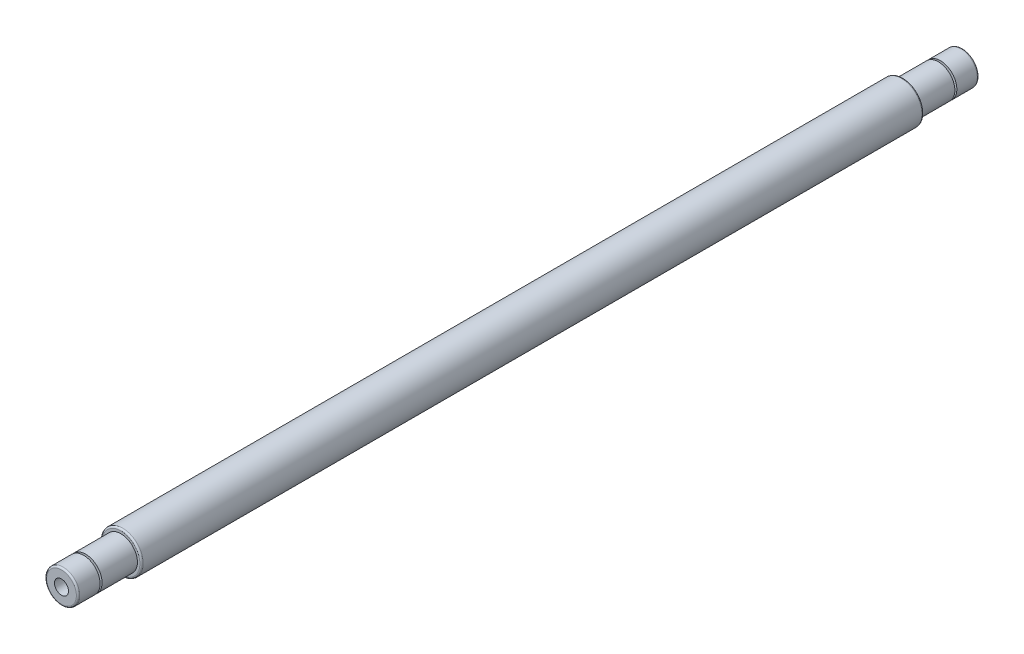
ISO-10303-21;
HEADER;
FILE_DESCRIPTION(('STEP AP214'),'2;1');
FILE_NAME('part.step','',(''),(''),'','','');
FILE_SCHEMA(('AUTOMOTIVE_DESIGN { 1 0 10303 214 1 1 1 1 }'));
ENDSEC;
DATA;
#1=APPLICATION_CONTEXT('core data for automotive mechanical design processes');
#2=APPLICATION_PROTOCOL_DEFINITION('international standard','automotive_design',2000,#1);
#3=PRODUCT_CONTEXT('',#1,'mechanical');
#4=PRODUCT('Part','Part','',(#3));
#5=PRODUCT_RELATED_PRODUCT_CATEGORY('part','',(#4));
#6=PRODUCT_DEFINITION_FORMATION('','',#4);
#7=PRODUCT_DEFINITION_CONTEXT('part definition',#1,'design');
#8=PRODUCT_DEFINITION('design','',#6,#7);
#9=PRODUCT_DEFINITION_SHAPE('','',#8);
#10=(LENGTH_UNIT() NAMED_UNIT(*) SI_UNIT(.MILLI.,.METRE.));
#11=(NAMED_UNIT(*) PLANE_ANGLE_UNIT() SI_UNIT($,.RADIAN.));
#12=(NAMED_UNIT(*) SI_UNIT($,.STERADIAN.) SOLID_ANGLE_UNIT());
#13=UNCERTAINTY_MEASURE_WITH_UNIT(LENGTH_MEASURE(1.E-05),#10,'distance_accuracy_value','');
#14=(GEOMETRIC_REPRESENTATION_CONTEXT(3) GLOBAL_UNCERTAINTY_ASSIGNED_CONTEXT((#13)) GLOBAL_UNIT_ASSIGNED_CONTEXT((#10,
#11,#12)) REPRESENTATION_CONTEXT('',''));
#15=CARTESIAN_POINT('',(0.,0.,0.));
#16=DIRECTION('',(0.,0.,1.));
#17=DIRECTION('',(1.,0.,0.));
#18=AXIS2_PLACEMENT_3D('',#15,#16,#17);
#19=CARTESIAN_POINT('',(0.,0.,510.));
#20=DIRECTION('',(0.,0.,1.));
#21=DIRECTION('',(1.,0.,0.));
#22=AXIS2_PLACEMENT_3D('',#19,#20,#21);
#23=CYLINDRICAL_SURFACE('',#22,10.);
#24=CARTESIAN_POINT('',(0.,0.,545.));
#25=DIRECTION('',(0.,0.,1.));
#26=DIRECTION('',(1.,0.,0.));
#27=AXIS2_PLACEMENT_3D('',#24,#25,#26);
#28=CIRCLE('',#27,10.);
#29=CARTESIAN_POINT('',(10.,0.,545.));
#30=VERTEX_POINT('',#29);
#31=EDGE_CURVE('E62',#30,#30,#28,.F.);
#32=ORIENTED_EDGE('',*,*,#31,.T.);
#33=EDGE_LOOP('',(#32));
#34=FACE_BOUND('',#33,.T.);
#35=CARTESIAN_POINT('',(0.,0.,532.6));
#36=DIRECTION('',(0.,0.,1.));
#37=DIRECTION('',(1.,0.,0.));
#38=AXIS2_PLACEMENT_3D('',#35,#36,#37);
#39=CIRCLE('',#38,10.);
#40=CARTESIAN_POINT('',(10.,0.,532.6));
#41=VERTEX_POINT('',#40);
#42=EDGE_CURVE('E73',#41,#41,#39,.F.);
#43=ORIENTED_EDGE('',*,*,#42,.F.);
#44=EDGE_LOOP('',(#43));
#45=FACE_BOUND('',#44,.T.);
#46=ADVANCED_FACE('F36',(#34,#45),#23,.T.);
#47=CARTESIAN_POINT('',(0.,0.,526.));
#48=DIRECTION('',(0.,0.,1.));
#49=DIRECTION('',(1.,0.,0.));
#50=AXIS2_PLACEMENT_3D('',#47,#48,#49);
#51=PLANE('',#50);
#52=CARTESIAN_POINT('',(0.,0.,526.));
#53=DIRECTION('',(0.,0.,1.));
#54=DIRECTION('',(1.,0.,0.));
#55=AXIS2_PLACEMENT_3D('',#52,#53,#54);
#56=CIRCLE('',#55,4.25);
#57=CARTESIAN_POINT('',(4.25,0.,526.));
#58=VERTEX_POINT('',#57);
#59=EDGE_CURVE('E68',#58,#58,#56,.T.);
#60=ORIENTED_EDGE('',*,*,#59,.T.);
#61=EDGE_LOOP('',(#60));
#62=FACE_BOUND('',#61,.T.);
#63=ADVANCED_FACE('F129',(#62),#51,.T.);
#64=CARTESIAN_POINT('',(0.,0.,526.));
#65=DIRECTION('',(0.,0.,1.));
#66=DIRECTION('',(1.,0.,0.));
#67=AXIS2_PLACEMENT_3D('',#64,#65,#66);
#68=CYLINDRICAL_SURFACE('',#67,4.25);
#69=ORIENTED_EDGE('',*,*,#59,.F.);
#70=EDGE_LOOP('',(#69));
#71=FACE_BOUND('',#70,.T.);
#72=CARTESIAN_POINT('',(0.,0.,546.));
#73=DIRECTION('',(0.,0.,1.));
#74=DIRECTION('',(1.,0.,0.));
#75=AXIS2_PLACEMENT_3D('',#72,#73,#74);
#76=CIRCLE('',#75,4.25);
#77=CARTESIAN_POINT('',(4.25,0.,546.));
#78=VERTEX_POINT('',#77);
#79=EDGE_CURVE('E83',#78,#78,#76,.T.);
#80=ORIENTED_EDGE('',*,*,#79,.T.);
#81=EDGE_LOOP('',(#80));
#82=FACE_BOUND('',#81,.T.);
#83=ADVANCED_FACE('F136',(#71,#82),#68,.F.);
#84=CARTESIAN_POINT('',(0.,0.,546.));
#85=DIRECTION('',(0.,0.,1.));
#86=DIRECTION('',(1.,0.,0.));
#87=AXIS2_PLACEMENT_3D('',#84,#85,#86);
#88=PLANE('',#87);
#89=CARTESIAN_POINT('',(0.,0.,546.));
#90=DIRECTION('',(0.,0.,1.));
#91=DIRECTION('',(1.,0.,0.));
#92=AXIS2_PLACEMENT_3D('',#89,#90,#91);
#93=CIRCLE('',#92,9.);
#94=CARTESIAN_POINT('',(9.,0.,546.));
#95=VERTEX_POINT('',#94);
#96=EDGE_CURVE('E65',#95,#95,#93,.T.);
#97=ORIENTED_EDGE('',*,*,#96,.T.);
#98=EDGE_LOOP('',(#97));
#99=FACE_BOUND('',#98,.T.);
#100=ORIENTED_EDGE('',*,*,#79,.F.);
#101=EDGE_LOOP('',(#100));
#102=FACE_BOUND('',#101,.T.);
#103=ADVANCED_FACE('F169',(#99,#102),#88,.T.);
#104=CARTESIAN_POINT('',(0.,0.,0.));
#105=DIRECTION('',(0.,0.,-1.));
#106=DIRECTION('',(-1.,0.,0.));
#107=AXIS2_PLACEMENT_3D('',#104,#105,#106);
#108=CYLINDRICAL_SURFACE('',#107,8.15);
#109=CARTESIAN_POINT('',(0.,0.,531.4));
#110=DIRECTION('',(0.,0.,-1.));
#111=DIRECTION('',(-1.,0.,0.));
#112=AXIS2_PLACEMENT_3D('',#109,#110,#111);
#113=CIRCLE('',#112,8.15);
#114=CARTESIAN_POINT('',(-8.15,0.,531.4));
#115=VERTEX_POINT('',#114);
#116=EDGE_CURVE('E99',#115,#115,#113,.T.);
#117=ORIENTED_EDGE('',*,*,#116,.F.);
#118=EDGE_LOOP('',(#117));
#119=FACE_BOUND('',#118,.T.);
#120=CARTESIAN_POINT('',(0.,0.,532.6));
#121=DIRECTION('',(0.,0.,-1.));
#122=DIRECTION('',(-1.,0.,0.));
#123=AXIS2_PLACEMENT_3D('',#120,#121,#122);
#124=CIRCLE('',#123,8.15);
#125=CARTESIAN_POINT('',(-8.15,0.,532.6));
#126=VERTEX_POINT('',#125);
#127=EDGE_CURVE('E103',#126,#126,#124,.T.);
#128=ORIENTED_EDGE('',*,*,#127,.T.);
#129=EDGE_LOOP('',(#128));
#130=FACE_BOUND('',#129,.T.);
#131=ADVANCED_FACE('F163',(#119,#130),#108,.T.);
#132=CARTESIAN_POINT('',(-11.85,0.,531.4));
#133=DIRECTION('',(0.,0.,-1.));
#134=DIRECTION('',(-1.,0.,0.));
#135=AXIS2_PLACEMENT_3D('',#132,#133,#134);
#136=PLANE('',#135);
#137=CARTESIAN_POINT('',(0.,0.,531.4));
#138=DIRECTION('',(0.,0.,-1.));
#139=DIRECTION('',(-1.,0.,0.));
#140=AXIS2_PLACEMENT_3D('',#137,#138,#139);
#141=CIRCLE('',#140,10.);
#142=CARTESIAN_POINT('',(-10.,0.,531.4));
#143=VERTEX_POINT('',#142);
#144=EDGE_CURVE('E69',#143,#143,#141,.F.);
#145=ORIENTED_EDGE('',*,*,#144,.T.);
#146=EDGE_LOOP('',(#145));
#147=FACE_BOUND('',#146,.T.);
#148=ORIENTED_EDGE('',*,*,#116,.T.);
#149=EDGE_LOOP('',(#148));
#150=FACE_BOUND('',#149,.T.);
#151=ADVANCED_FACE('F160',(#147,#150),#136,.F.);
#152=CARTESIAN_POINT('',(-11.85,0.,532.6));
#153=DIRECTION('',(0.,0.,1.));
#154=DIRECTION('',(1.,0.,0.));
#155=AXIS2_PLACEMENT_3D('',#152,#153,#154);
#156=PLANE('',#155);
#157=ORIENTED_EDGE('',*,*,#42,.T.);
#158=EDGE_LOOP('',(#157));
#159=FACE_BOUND('',#158,.T.);
#160=ORIENTED_EDGE('',*,*,#127,.F.);
#161=EDGE_LOOP('',(#160));
#162=FACE_BOUND('',#161,.T.);
#163=ADVANCED_FACE('F153',(#159,#162),#156,.F.);
#164=CARTESIAN_POINT('',(0.,0.,510.));
#165=DIRECTION('',(0.,0.,1.));
#166=DIRECTION('',(1.,0.,0.));
#167=AXIS2_PLACEMENT_3D('',#164,#165,#166);
#168=PLANE('',#167);
#169=CARTESIAN_POINT('',(0.,0.,510.));
#170=DIRECTION('',(0.,0.,1.));
#171=DIRECTION('',(1.,0.,0.));
#172=AXIS2_PLACEMENT_3D('',#169,#170,#171);
#173=CIRCLE('',#172,11.5);
#174=CARTESIAN_POINT('',(11.5,0.,510.));
#175=VERTEX_POINT('',#174);
#176=EDGE_CURVE('E59',#175,#175,#173,.T.);
#177=ORIENTED_EDGE('',*,*,#176,.T.);
#178=EDGE_LOOP('',(#177));
#179=FACE_BOUND('',#178,.T.);
#180=CARTESIAN_POINT('',(0.,0.,510.));
#181=DIRECTION('',(0.,0.,1.));
#182=DIRECTION('',(1.,0.,0.));
#183=AXIS2_PLACEMENT_3D('',#180,#181,#182);
#184=CIRCLE('',#183,10.);
#185=CARTESIAN_POINT('',(10.,0.,510.));
#186=VERTEX_POINT('',#185);
#187=EDGE_CURVE('E92',#186,#186,#184,.T.);
#188=ORIENTED_EDGE('',*,*,#187,.F.);
#189=EDGE_LOOP('',(#188));
#190=FACE_BOUND('',#189,.T.);
#191=ADVANCED_FACE('F144',(#179,#190),#168,.T.);
#192=ORIENTED_EDGE('',*,*,#144,.F.);
#193=EDGE_LOOP('',(#192));
#194=FACE_BOUND('',#193,.T.);
#195=ORIENTED_EDGE('',*,*,#187,.T.);
#196=EDGE_LOOP('',(#195));
#197=FACE_BOUND('',#196,.T.);
#198=ADVANCED_FACE('F132',(#194,#197),#23,.T.);
#199=CARTESIAN_POINT('',(0.,0.,546.));
#200=DIRECTION('',(0.,0.,-1.));
#201=DIRECTION('',(-1.,0.,0.));
#202=AXIS2_PLACEMENT_3D('',#199,#200,#201);
#203=CYLINDRICAL_SURFACE('',#202,12.5);
#204=CARTESIAN_POINT('',(0.,0.,509.));
#205=DIRECTION('',(0.,0.,1.));
#206=DIRECTION('',(1.,0.,0.));
#207=AXIS2_PLACEMENT_3D('',#204,#205,#206);
#208=CIRCLE('',#207,12.5);
#209=CARTESIAN_POINT('',(12.5,0.,509.));
#210=VERTEX_POINT('',#209);
#211=EDGE_CURVE('E51',#210,#210,#208,.F.);
#212=ORIENTED_EDGE('',*,*,#211,.T.);
#213=EDGE_LOOP('',(#212));
#214=FACE_BOUND('',#213,.T.);
#215=CARTESIAN_POINT('',(0.,0.,37.));
#216=DIRECTION('',(0.,0.,-1.));
#217=DIRECTION('',(-1.,0.,0.));
#218=AXIS2_PLACEMENT_3D('',#215,#216,#217);
#219=CIRCLE('',#218,12.5);
#220=CARTESIAN_POINT('',(-12.5,0.,37.));
#221=VERTEX_POINT('',#220);
#222=EDGE_CURVE('E56',#221,#221,#219,.F.);
#223=ORIENTED_EDGE('',*,*,#222,.T.);
#224=EDGE_LOOP('',(#223));
#225=FACE_BOUND('',#224,.T.);
#226=ADVANCED_FACE('F143',(#214,#225),#203,.T.);
#227=CARTESIAN_POINT('',(0.,0.,36.));
#228=DIRECTION('',(0.,0.,-1.));
#229=DIRECTION('',(-1.,0.,0.));
#230=AXIS2_PLACEMENT_3D('',#227,#228,#229);
#231=PLANE('',#230);
#232=CARTESIAN_POINT('',(0.,0.,36.));
#233=DIRECTION('',(0.,0.,-1.));
#234=DIRECTION('',(-1.,0.,0.));
#235=AXIS2_PLACEMENT_3D('',#232,#233,#234);
#236=CIRCLE('',#235,11.5);
#237=CARTESIAN_POINT('',(-11.5,0.,36.));
#238=VERTEX_POINT('',#237);
#239=EDGE_CURVE('E47',#238,#238,#236,.T.);
#240=ORIENTED_EDGE('',*,*,#239,.T.);
#241=EDGE_LOOP('',(#240));
#242=FACE_BOUND('',#241,.T.);
#243=CARTESIAN_POINT('',(0.,0.,36.));
#244=DIRECTION('',(0.,0.,-1.));
#245=DIRECTION('',(-1.,0.,0.));
#246=AXIS2_PLACEMENT_3D('',#243,#244,#245);
#247=CIRCLE('',#246,10.);
#248=CARTESIAN_POINT('',(-10.,0.,36.));
#249=VERTEX_POINT('',#248);
#250=EDGE_CURVE('E72',#249,#249,#247,.T.);
#251=ORIENTED_EDGE('',*,*,#250,.F.);
#252=EDGE_LOOP('',(#251));
#253=FACE_BOUND('',#252,.T.);
#254=ADVANCED_FACE('F150',(#242,#253),#231,.T.);
#255=CARTESIAN_POINT('',(0.,0.,36.));
#256=DIRECTION('',(0.,0.,-1.));
#257=DIRECTION('',(-1.,0.,0.));
#258=AXIS2_PLACEMENT_3D('',#255,#256,#257);
#259=CYLINDRICAL_SURFACE('',#258,10.);
#260=CARTESIAN_POINT('',(0.,0.,14.6));
#261=DIRECTION('',(0.,0.,1.));
#262=DIRECTION('',(1.,0.,0.));
#263=AXIS2_PLACEMENT_3D('',#260,#261,#262);
#264=CIRCLE('',#263,10.);
#265=CARTESIAN_POINT('',(10.,0.,14.6));
#266=VERTEX_POINT('',#265);
#267=EDGE_CURVE('E79',#266,#266,#264,.F.);
#268=ORIENTED_EDGE('',*,*,#267,.F.);
#269=EDGE_LOOP('',(#268));
#270=FACE_BOUND('',#269,.T.);
#271=ORIENTED_EDGE('',*,*,#250,.T.);
#272=EDGE_LOOP('',(#271));
#273=FACE_BOUND('',#272,.T.);
#274=ADVANCED_FACE('F180',(#270,#273),#259,.T.);
#275=CARTESIAN_POINT('',(0.,0.,0.));
#276=DIRECTION('',(0.,0.,-1.));
#277=DIRECTION('',(-1.,0.,0.));
#278=AXIS2_PLACEMENT_3D('',#275,#276,#277);
#279=CYLINDRICAL_SURFACE('',#278,8.15);
#280=CARTESIAN_POINT('',(0.,0.,13.4));
#281=DIRECTION('',(0.,0.,-1.));
#282=DIRECTION('',(-1.,0.,0.));
#283=AXIS2_PLACEMENT_3D('',#280,#281,#282);
#284=CIRCLE('',#283,8.15);
#285=CARTESIAN_POINT('',(-8.15,0.,13.4));
#286=VERTEX_POINT('',#285);
#287=EDGE_CURVE('E82',#286,#286,#284,.T.);
#288=ORIENTED_EDGE('',*,*,#287,.F.);
#289=EDGE_LOOP('',(#288));
#290=FACE_BOUND('',#289,.T.);
#291=CARTESIAN_POINT('',(0.,0.,14.6));
#292=DIRECTION('',(0.,0.,-1.));
#293=DIRECTION('',(-1.,0.,0.));
#294=AXIS2_PLACEMENT_3D('',#291,#292,#293);
#295=CIRCLE('',#294,8.15);
#296=CARTESIAN_POINT('',(-8.15,0.,14.6));
#297=VERTEX_POINT('',#296);
#298=EDGE_CURVE('E102',#297,#297,#295,.T.);
#299=ORIENTED_EDGE('',*,*,#298,.T.);
#300=EDGE_LOOP('',(#299));
#301=FACE_BOUND('',#300,.T.);
#302=ADVANCED_FACE('F111',(#290,#301),#279,.T.);
#303=CARTESIAN_POINT('',(-11.85,0.,13.4));
#304=DIRECTION('',(0.,0.,-1.));
#305=DIRECTION('',(-1.,0.,0.));
#306=AXIS2_PLACEMENT_3D('',#303,#304,#305);
#307=PLANE('',#306);
#308=CARTESIAN_POINT('',(0.,0.,13.4));
#309=DIRECTION('',(0.,0.,-1.));
#310=DIRECTION('',(-1.,0.,0.));
#311=AXIS2_PLACEMENT_3D('',#308,#309,#310);
#312=CIRCLE('',#311,10.);
#313=CARTESIAN_POINT('',(-10.,0.,13.4));
#314=VERTEX_POINT('',#313);
#315=EDGE_CURVE('E76',#314,#314,#312,.F.);
#316=ORIENTED_EDGE('',*,*,#315,.T.);
#317=EDGE_LOOP('',(#316));
#318=FACE_BOUND('',#317,.T.);
#319=ORIENTED_EDGE('',*,*,#287,.T.);
#320=EDGE_LOOP('',(#319));
#321=FACE_BOUND('',#320,.T.);
#322=ADVANCED_FACE('F116',(#318,#321),#307,.F.);
#323=CARTESIAN_POINT('',(-11.85,0.,14.6));
#324=DIRECTION('',(0.,0.,1.));
#325=DIRECTION('',(1.,0.,0.));
#326=AXIS2_PLACEMENT_3D('',#323,#324,#325);
#327=PLANE('',#326);
#328=ORIENTED_EDGE('',*,*,#267,.T.);
#329=EDGE_LOOP('',(#328));
#330=FACE_BOUND('',#329,.T.);
#331=ORIENTED_EDGE('',*,*,#298,.F.);
#332=EDGE_LOOP('',(#331));
#333=FACE_BOUND('',#332,.T.);
#334=ADVANCED_FACE('F113',(#330,#333),#327,.F.);
#335=CARTESIAN_POINT('',(0.,0.,20.));
#336=DIRECTION('',(0.,0.,-1.));
#337=DIRECTION('',(-1.,0.,0.));
#338=AXIS2_PLACEMENT_3D('',#335,#336,#337);
#339=PLANE('',#338);
#340=CARTESIAN_POINT('',(0.,0.,20.));
#341=DIRECTION('',(0.,0.,-1.));
#342=DIRECTION('',(-1.,0.,0.));
#343=AXIS2_PLACEMENT_3D('',#340,#341,#342);
#344=CIRCLE('',#343,4.25);
#345=CARTESIAN_POINT('',(-4.25,0.,20.));
#346=VERTEX_POINT('',#345);
#347=EDGE_CURVE('E86',#346,#346,#344,.T.);
#348=ORIENTED_EDGE('',*,*,#347,.T.);
#349=EDGE_LOOP('',(#348));
#350=FACE_BOUND('',#349,.T.);
#351=ADVANCED_FACE('F115',(#350),#339,.T.);
#352=CARTESIAN_POINT('',(0.,0.,20.));
#353=DIRECTION('',(0.,0.,-1.));
#354=DIRECTION('',(-1.,0.,0.));
#355=AXIS2_PLACEMENT_3D('',#352,#353,#354);
#356=CYLINDRICAL_SURFACE('',#355,4.25);
#357=ORIENTED_EDGE('',*,*,#347,.F.);
#358=EDGE_LOOP('',(#357));
#359=FACE_BOUND('',#358,.T.);
#360=CARTESIAN_POINT('',(0.,0.,0.));
#361=DIRECTION('',(0.,0.,-1.));
#362=DIRECTION('',(-1.,0.,0.));
#363=AXIS2_PLACEMENT_3D('',#360,#361,#362);
#364=CIRCLE('',#363,4.25);
#365=CARTESIAN_POINT('',(-4.25,0.,0.));
#366=VERTEX_POINT('',#365);
#367=EDGE_CURVE('E89',#366,#366,#364,.T.);
#368=ORIENTED_EDGE('',*,*,#367,.T.);
#369=EDGE_LOOP('',(#368));
#370=FACE_BOUND('',#369,.T.);
#371=ADVANCED_FACE('F123',(#359,#370),#356,.F.);
#372=CARTESIAN_POINT('',(0.,0.,0.));
#373=DIRECTION('',(0.,0.,1.));
#374=DIRECTION('',(1.,0.,0.));
#375=AXIS2_PLACEMENT_3D('',#372,#373,#374);
#376=PLANE('',#375);
#377=CARTESIAN_POINT('',(0.,0.,0.));
#378=DIRECTION('',(0.,0.,1.));
#379=DIRECTION('',(1.,0.,0.));
#380=AXIS2_PLACEMENT_3D('',#377,#378,#379);
#381=CIRCLE('',#380,9.);
#382=CARTESIAN_POINT('',(9.,0.,0.));
#383=VERTEX_POINT('',#382);
#384=EDGE_CURVE('E43',#383,#383,#381,.F.);
#385=ORIENTED_EDGE('',*,*,#384,.T.);
#386=EDGE_LOOP('',(#385));
#387=FACE_BOUND('',#386,.T.);
#388=ORIENTED_EDGE('',*,*,#367,.F.);
#389=EDGE_LOOP('',(#388));
#390=FACE_BOUND('',#389,.T.);
#391=ADVANCED_FACE('F210',(#387,#390),#376,.F.);
#392=CARTESIAN_POINT('',(0.,0.,1.));
#393=DIRECTION('',(0.,0.,1.));
#394=DIRECTION('',(1.,0.,0.));
#395=AXIS2_PLACEMENT_3D('',#392,#393,#394);
#396=CIRCLE('',#395,10.);
#397=CARTESIAN_POINT('',(10.,0.,1.));
#398=VERTEX_POINT('',#397);
#399=EDGE_CURVE('E10',#398,#398,#396,.T.);
#400=ORIENTED_EDGE('',*,*,#399,.T.);
#401=EDGE_LOOP('',(#400));
#402=FACE_BOUND('',#401,.T.);
#403=ORIENTED_EDGE('',*,*,#315,.F.);
#404=EDGE_LOOP('',(#403));
#405=FACE_BOUND('',#404,.T.);
#406=ADVANCED_FACE('F183',(#402,#405),#259,.T.);
#407=CARTESIAN_POINT('',(0.,0.,545.));
#408=DIRECTION('',(0.,0.,1.));
#409=DIRECTION('',(1.,0.,0.));
#410=AXIS2_PLACEMENT_3D('',#407,#408,#409);
#411=TOROIDAL_SURFACE('',#410,9.,1.);
#412=ORIENTED_EDGE('',*,*,#31,.F.);
#413=EDGE_LOOP('',(#412));
#414=FACE_BOUND('',#413,.T.);
#415=ORIENTED_EDGE('',*,*,#96,.F.);
#416=EDGE_LOOP('',(#415));
#417=FACE_BOUND('',#416,.T.);
#418=ADVANCED_FACE('F202',(#414,#417),#411,.T.);
#419=CARTESIAN_POINT('',(0.,0.,509.));
#420=DIRECTION('',(0.,0.,1.));
#421=DIRECTION('',(1.,0.,0.));
#422=AXIS2_PLACEMENT_3D('',#419,#420,#421);
#423=TOROIDAL_SURFACE('',#422,11.5,1.);
#424=ORIENTED_EDGE('',*,*,#211,.F.);
#425=EDGE_LOOP('',(#424));
#426=FACE_BOUND('',#425,.T.);
#427=ORIENTED_EDGE('',*,*,#176,.F.);
#428=EDGE_LOOP('',(#427));
#429=FACE_BOUND('',#428,.T.);
#430=ADVANCED_FACE('F195',(#426,#429),#423,.T.);
#431=CARTESIAN_POINT('',(0.,0.,37.));
#432=DIRECTION('',(0.,0.,-1.));
#433=DIRECTION('',(-1.,0.,0.));
#434=AXIS2_PLACEMENT_3D('',#431,#432,#433);
#435=TOROIDAL_SURFACE('',#434,11.5,1.);
#436=ORIENTED_EDGE('',*,*,#222,.F.);
#437=EDGE_LOOP('',(#436));
#438=FACE_BOUND('',#437,.T.);
#439=ORIENTED_EDGE('',*,*,#239,.F.);
#440=EDGE_LOOP('',(#439));
#441=FACE_BOUND('',#440,.T.);
#442=ADVANCED_FACE('F193',(#438,#441),#435,.T.);
#443=CARTESIAN_POINT('',(0.,0.,1.));
#444=DIRECTION('',(0.,0.,1.));
#445=DIRECTION('',(1.,0.,0.));
#446=AXIS2_PLACEMENT_3D('',#443,#444,#445);
#447=TOROIDAL_SURFACE('',#446,9.,1.);
#448=ORIENTED_EDGE('',*,*,#399,.F.);
#449=EDGE_LOOP('',(#448));
#450=FACE_BOUND('',#449,.T.);
#451=ORIENTED_EDGE('',*,*,#384,.F.);
#452=EDGE_LOOP('',(#451));
#453=FACE_BOUND('',#452,.T.);
#454=ADVANCED_FACE('F38',(#450,#453),#447,.T.);
#455=CLOSED_SHELL('',(#46,#63,#83,#103,#131,#151,#163,#191,#198,#226,#254,#274,#302,#322,#334,
#351,#371,#391,#406,#418,#430,#442,#454));
#456=MANIFOLD_SOLID_BREP('B2',#455);
#457=ADVANCED_BREP_SHAPE_REPRESENTATION('',(#18,#456),#14);
#458=SHAPE_DEFINITION_REPRESENTATION(#9,#457);
ENDSEC;
END-ISO-10303-21;
